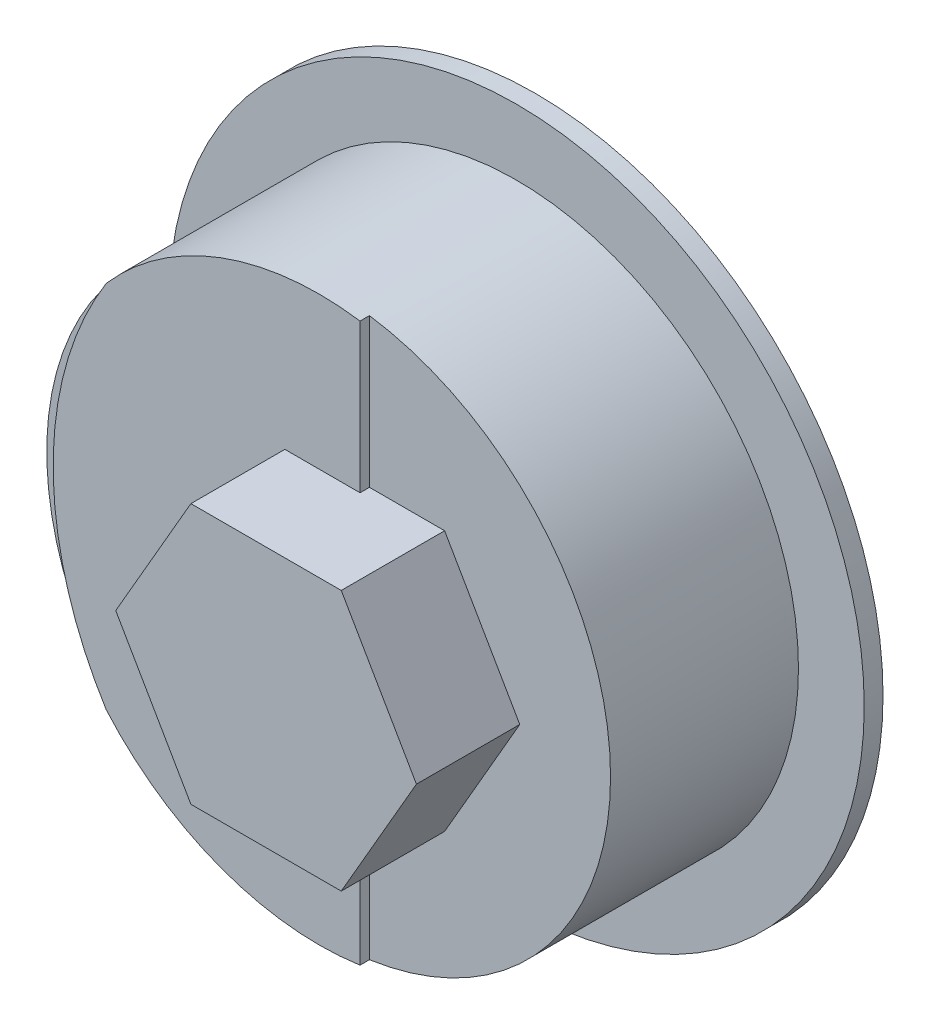
ISO-10303-21;
HEADER;
FILE_DESCRIPTION(('STEP AP214'),'2;1');
FILE_NAME('part.step','',(''),(''),'','','');
FILE_SCHEMA(('AUTOMOTIVE_DESIGN { 1 0 10303 214 1 1 1 1 }'));
ENDSEC;
DATA;
#1=APPLICATION_CONTEXT('core data for automotive mechanical design processes');
#2=APPLICATION_PROTOCOL_DEFINITION('international standard','automotive_design',2000,#1);
#3=PRODUCT_CONTEXT('',#1,'mechanical');
#4=PRODUCT('Part','Part','',(#3));
#5=PRODUCT_RELATED_PRODUCT_CATEGORY('part','',(#4));
#6=PRODUCT_DEFINITION_FORMATION('','',#4);
#7=PRODUCT_DEFINITION_CONTEXT('part definition',#1,'design');
#8=PRODUCT_DEFINITION('design','',#6,#7);
#9=PRODUCT_DEFINITION_SHAPE('','',#8);
#10=(LENGTH_UNIT() NAMED_UNIT(*) SI_UNIT(.MILLI.,.METRE.));
#11=(NAMED_UNIT(*) PLANE_ANGLE_UNIT() SI_UNIT($,.RADIAN.));
#12=(NAMED_UNIT(*) SI_UNIT($,.STERADIAN.) SOLID_ANGLE_UNIT());
#13=UNCERTAINTY_MEASURE_WITH_UNIT(LENGTH_MEASURE(1.E-05),#10,'distance_accuracy_value','');
#14=(GEOMETRIC_REPRESENTATION_CONTEXT(3) GLOBAL_UNCERTAINTY_ASSIGNED_CONTEXT((#13)) GLOBAL_UNIT_ASSIGNED_CONTEXT((#10,
#11,#12)) REPRESENTATION_CONTEXT('',''));
#15=CARTESIAN_POINT('',(0.,0.,0.));
#16=DIRECTION('',(0.,0.,1.));
#17=DIRECTION('',(1.,0.,0.));
#18=AXIS2_PLACEMENT_3D('',#15,#16,#17);
#19=CARTESIAN_POINT('',(0.,0.,5.));
#20=DIRECTION('',(0.,0.,1.));
#21=DIRECTION('',(1.,0.,0.));
#22=AXIS2_PLACEMENT_3D('',#19,#20,#21);
#23=PLANE('',#22);
#24=CARTESIAN_POINT('',(-2.17,0.,5.));
#25=DIRECTION('',(0.,0.,1.));
#26=DIRECTION('',(1.,0.,0.));
#27=AXIS2_PLACEMENT_3D('',#24,#25,#26);
#28=CIRCLE('',#27,15.);
#29=CARTESIAN_POINT('',(-13.5080645161291,9.82080918397741,5.));
#30=VERTEX_POINT('',#29);
#31=CARTESIAN_POINT('',(-13.5080645161291,-9.82080918397742,5.));
#32=VERTEX_POINT('',#31);
#33=EDGE_CURVE('E184',#30,#32,#28,.T.);
#34=ORIENTED_EDGE('',*,*,#33,.T.);
#35=CARTESIAN_POINT('',(2.17,0.,5.));
#36=DIRECTION('',(0.,0.,1.));
#37=DIRECTION('',(1.,0.,0.));
#38=AXIS2_PLACEMENT_3D('',#35,#36,#37);
#39=CIRCLE('',#38,18.5);
#40=EDGE_CURVE('E611',#30,#32,#39,.T.);
#41=ORIENTED_EDGE('',*,*,#40,.F.);
#42=EDGE_LOOP('',(#34,#41));
#43=FACE_BOUND('',#42,.T.);
#44=ADVANCED_FACE('F36',(#43),#23,.T.);
#45=DIRECTION('',(1.,0.,0.));
#46=VECTOR('',#45,1.);
#47=CARTESIAN_POINT('',(0.,-6.9282032302755,5.));
#48=LINE('',#47,#46);
#49=CARTESIAN_POINT('',(0.,-6.9282032302755,5.));
#50=VERTEX_POINT('',#49);
#51=CARTESIAN_POINT('',(4.,-6.9282032302755,5.));
#52=VERTEX_POINT('',#51);
#53=EDGE_CURVE('E198',#50,#52,#48,.T.);
#54=ORIENTED_EDGE('',*,*,#53,.F.);
#55=DIRECTION('',(0.,1.,0.));
#56=VECTOR('',#55,1.);
#57=CARTESIAN_POINT('',(0.,0.,5.));
#58=LINE('',#57,#56);
#59=CARTESIAN_POINT('',(0.,-14.8422067092464,5.));
#60=VERTEX_POINT('',#59);
#61=EDGE_CURVE('E603',#60,#50,#58,.T.);
#62=ORIENTED_EDGE('',*,*,#61,.F.);
#63=CARTESIAN_POINT('',(0.,14.8422067092464,5.));
#64=VERTEX_POINT('',#63);
#65=EDGE_CURVE('E277',#60,#64,#28,.T.);
#66=ORIENTED_EDGE('',*,*,#65,.T.);
#67=CARTESIAN_POINT('',(0.,6.9282032302755,5.));
#68=VERTEX_POINT('',#67);
#69=EDGE_CURVE('E178',#68,#64,#58,.T.);
#70=ORIENTED_EDGE('',*,*,#69,.F.);
#71=DIRECTION('',(-1.,0.,0.));
#72=VECTOR('',#71,1.);
#73=CARTESIAN_POINT('',(0.,6.9282032302755,5.));
#74=LINE('',#73,#72);
#75=CARTESIAN_POINT('',(3.99999999999999,6.9282032302755,5.));
#76=VERTEX_POINT('',#75);
#77=EDGE_CURVE('E210',#76,#68,#74,.T.);
#78=ORIENTED_EDGE('',*,*,#77,.F.);
#79=DIRECTION('',(-0.5,0.866025403784438,0.));
#80=VECTOR('',#79,1.);
#81=CARTESIAN_POINT('',(5.99999999999999,3.46410161513775,5.));
#82=LINE('',#81,#80);
#83=CARTESIAN_POINT('',(7.99999999999999,0.,5.));
#84=VERTEX_POINT('',#83);
#85=EDGE_CURVE('E188',#84,#76,#82,.T.);
#86=ORIENTED_EDGE('',*,*,#85,.F.);
#87=DIRECTION('',(0.5,0.866025403784439,0.));
#88=VECTOR('',#87,1.);
#89=CARTESIAN_POINT('',(5.99999999999999,-3.46410161513775,5.));
#90=LINE('',#89,#88);
#91=EDGE_CURVE('E185',#52,#84,#90,.T.);
#92=ORIENTED_EDGE('',*,*,#91,.F.);
#93=EDGE_LOOP('',(#54,#62,#66,#70,#78,#86,#92));
#94=FACE_BOUND('',#93,.T.);
#95=ADVANCED_FACE('F324',(#94),#23,.T.);
#96=CARTESIAN_POINT('',(0.,-6.9282032302755,10.5));
#97=DIRECTION('',(0.,1.,0.));
#98=DIRECTION('',(-1.,0.,0.));
#99=AXIS2_PLACEMENT_3D('',#96,#97,#98);
#100=PLANE('',#99);
#101=DIRECTION('',(0.,0.,-1.));
#102=VECTOR('',#101,1.);
#103=CARTESIAN_POINT('',(0.,-6.9282032302755,5.5));
#104=LINE('',#103,#102);
#105=CARTESIAN_POINT('',(0.,-6.9282032302755,5.5));
#106=VERTEX_POINT('',#105);
#107=EDGE_CURVE('E606',#106,#50,#104,.T.);
#108=ORIENTED_EDGE('',*,*,#107,.T.);
#109=ORIENTED_EDGE('',*,*,#53,.T.);
#110=DIRECTION('',(0.,0.,-1.));
#111=VECTOR('',#110,1.);
#112=CARTESIAN_POINT('',(4.,-6.9282032302755,10.5));
#113=LINE('',#112,#111);
#114=CARTESIAN_POINT('',(4.,-6.9282032302755,10.5));
#115=VERTEX_POINT('',#114);
#116=EDGE_CURVE('E207',#115,#52,#113,.T.);
#117=ORIENTED_EDGE('',*,*,#116,.F.);
#118=DIRECTION('',(1.,0.,0.));
#119=VECTOR('',#118,1.);
#120=CARTESIAN_POINT('',(0.,-6.9282032302755,10.5));
#121=LINE('',#120,#119);
#122=CARTESIAN_POINT('',(-3.99999999999999,-6.9282032302755,10.5));
#123=VERTEX_POINT('',#122);
#124=EDGE_CURVE('E206',#123,#115,#121,.T.);
#125=ORIENTED_EDGE('',*,*,#124,.F.);
#126=DIRECTION('',(0.,0.,-1.));
#127=VECTOR('',#126,1.);
#128=CARTESIAN_POINT('',(-3.99999999999999,-6.9282032302755,10.5));
#129=LINE('',#128,#127);
#130=CARTESIAN_POINT('',(-3.99999999999999,-6.9282032302755,5.5));
#131=VERTEX_POINT('',#130);
#132=EDGE_CURVE('E216',#123,#131,#129,.T.);
#133=ORIENTED_EDGE('',*,*,#132,.T.);
#134=DIRECTION('',(-1.,0.,0.));
#135=VECTOR('',#134,1.);
#136=CARTESIAN_POINT('',(0.,-6.9282032302755,5.5));
#137=LINE('',#136,#135);
#138=EDGE_CURVE('E614',#106,#131,#137,.T.);
#139=ORIENTED_EDGE('',*,*,#138,.F.);
#140=EDGE_LOOP('',(#108,#109,#117,#125,#133,#139));
#141=FACE_BOUND('',#140,.T.);
#142=ADVANCED_FACE('F330',(#141),#100,.F.);
#143=CARTESIAN_POINT('',(0.,6.9282032302755,10.5));
#144=DIRECTION('',(0.,-1.,0.));
#145=DIRECTION('',(0.,0.,-1.));
#146=AXIS2_PLACEMENT_3D('',#143,#144,#145);
#147=PLANE('',#146);
#148=DIRECTION('',(0.,0.,-1.));
#149=VECTOR('',#148,1.);
#150=CARTESIAN_POINT('',(0.,6.9282032302755,5.5));
#151=LINE('',#150,#149);
#152=CARTESIAN_POINT('',(0.,6.9282032302755,5.5));
#153=VERTEX_POINT('',#152);
#154=EDGE_CURVE('E615',#153,#68,#151,.T.);
#155=ORIENTED_EDGE('',*,*,#154,.F.);
#156=DIRECTION('',(1.,0.,0.));
#157=VECTOR('',#156,1.);
#158=CARTESIAN_POINT('',(0.,6.9282032302755,5.5));
#159=LINE('',#158,#157);
#160=CARTESIAN_POINT('',(-4.,6.9282032302755,5.5));
#161=VERTEX_POINT('',#160);
#162=EDGE_CURVE('E630',#161,#153,#159,.T.);
#163=ORIENTED_EDGE('',*,*,#162,.F.);
#164=DIRECTION('',(0.,0.,-1.));
#165=VECTOR('',#164,1.);
#166=CARTESIAN_POINT('',(-4.,6.9282032302755,10.5));
#167=LINE('',#166,#165);
#168=CARTESIAN_POINT('',(-4.,6.9282032302755,10.5));
#169=VERTEX_POINT('',#168);
#170=EDGE_CURVE('E222',#169,#161,#167,.T.);
#171=ORIENTED_EDGE('',*,*,#170,.F.);
#172=DIRECTION('',(-1.,0.,0.));
#173=VECTOR('',#172,1.);
#174=CARTESIAN_POINT('',(0.,6.9282032302755,10.5));
#175=LINE('',#174,#173);
#176=CARTESIAN_POINT('',(3.99999999999999,6.9282032302755,10.5));
#177=VERTEX_POINT('',#176);
#178=EDGE_CURVE('E200',#177,#169,#175,.T.);
#179=ORIENTED_EDGE('',*,*,#178,.F.);
#180=DIRECTION('',(0.,0.,-1.));
#181=VECTOR('',#180,1.);
#182=CARTESIAN_POINT('',(3.99999999999999,6.9282032302755,10.5));
#183=LINE('',#182,#181);
#184=EDGE_CURVE('E225',#177,#76,#183,.T.);
#185=ORIENTED_EDGE('',*,*,#184,.T.);
#186=ORIENTED_EDGE('',*,*,#77,.T.);
#187=EDGE_LOOP('',(#155,#163,#171,#179,#185,#186));
#188=FACE_BOUND('',#187,.T.);
#189=ADVANCED_FACE('F374',(#188),#147,.F.);
#190=CARTESIAN_POINT('',(0.,3.46410161513775,5.));
#191=DIRECTION('',(0.,-1.,0.));
#192=DIRECTION('',(1.,0.,0.));
#193=AXIS2_PLACEMENT_3D('',#190,#191,#192);
#194=PLANE('',#193);
#195=DIRECTION('',(0.,0.,-1.));
#196=VECTOR('',#195,1.);
#197=CARTESIAN_POINT('',(-2.,3.46410161513775,5.));
#198=LINE('',#197,#196);
#199=CARTESIAN_POINT('',(-2.,3.46410161513776,5.));
#200=VERTEX_POINT('',#199);
#201=CARTESIAN_POINT('',(-2.,3.46410161513776,-6.5));
#202=VERTEX_POINT('',#201);
#203=EDGE_CURVE('E282',#200,#202,#198,.T.);
#204=ORIENTED_EDGE('',*,*,#203,.T.);
#205=DIRECTION('',(-1.,0.,0.));
#206=VECTOR('',#205,1.);
#207=CARTESIAN_POINT('',(0.,3.46410161513775,-6.5));
#208=LINE('',#207,#206);
#209=CARTESIAN_POINT('',(2.,3.46410161513775,-6.5));
#210=VERTEX_POINT('',#209);
#211=EDGE_CURVE('E237',#210,#202,#208,.T.);
#212=ORIENTED_EDGE('',*,*,#211,.F.);
#213=DIRECTION('',(0.,0.,-1.));
#214=VECTOR('',#213,1.);
#215=CARTESIAN_POINT('',(2.,3.46410161513775,5.));
#216=LINE('',#215,#214);
#217=CARTESIAN_POINT('',(2.,3.46410161513775,5.));
#218=VERTEX_POINT('',#217);
#219=EDGE_CURVE('E11',#218,#210,#216,.T.);
#220=ORIENTED_EDGE('',*,*,#219,.F.);
#221=DIRECTION('',(-1.,0.,0.));
#222=VECTOR('',#221,1.);
#223=CARTESIAN_POINT('',(0.,3.46410161513775,5.));
#224=LINE('',#223,#222);
#225=EDGE_CURVE('E261',#218,#200,#224,.T.);
#226=ORIENTED_EDGE('',*,*,#225,.T.);
#227=EDGE_LOOP('',(#204,#212,#220,#226));
#228=FACE_BOUND('',#227,.T.);
#229=ADVANCED_FACE('F38',(#228),#194,.T.);
#230=CARTESIAN_POINT('',(3.,1.73205080756888,5.));
#231=DIRECTION('',(-0.866025403784439,-0.5,0.));
#232=DIRECTION('',(0.5,-0.866025403784439,0.));
#233=AXIS2_PLACEMENT_3D('',#230,#231,#232);
#234=PLANE('',#233);
#235=ORIENTED_EDGE('',*,*,#219,.T.);
#236=DIRECTION('',(-0.5,0.866025403784439,0.));
#237=VECTOR('',#236,1.);
#238=CARTESIAN_POINT('',(3.,1.73205080756888,-6.5));
#239=LINE('',#238,#237);
#240=CARTESIAN_POINT('',(4.,0.,-6.5));
#241=VERTEX_POINT('',#240);
#242=EDGE_CURVE('E234',#241,#210,#239,.T.);
#243=ORIENTED_EDGE('',*,*,#242,.F.);
#244=DIRECTION('',(0.,0.,-1.));
#245=VECTOR('',#244,1.);
#246=CARTESIAN_POINT('',(4.,0.,5.));
#247=LINE('',#246,#245);
#248=CARTESIAN_POINT('',(4.,0.,5.));
#249=VERTEX_POINT('',#248);
#250=EDGE_CURVE('E44',#249,#241,#247,.T.);
#251=ORIENTED_EDGE('',*,*,#250,.F.);
#252=DIRECTION('',(-0.5,0.866025403784439,0.));
#253=VECTOR('',#252,1.);
#254=CARTESIAN_POINT('',(3.,1.73205080756888,5.));
#255=LINE('',#254,#253);
#256=EDGE_CURVE('E264',#249,#218,#255,.T.);
#257=ORIENTED_EDGE('',*,*,#256,.T.);
#258=EDGE_LOOP('',(#235,#243,#251,#257));
#259=FACE_BOUND('',#258,.T.);
#260=ADVANCED_FACE('F296',(#259),#234,.T.);
#261=CARTESIAN_POINT('',(3.,-1.73205080756888,5.));
#262=DIRECTION('',(-0.866025403784439,0.5,0.));
#263=DIRECTION('',(-0.5,-0.866025403784439,0.));
#264=AXIS2_PLACEMENT_3D('',#261,#262,#263);
#265=PLANE('',#264);
#266=ORIENTED_EDGE('',*,*,#250,.T.);
#267=DIRECTION('',(0.5,0.866025403784439,0.));
#268=VECTOR('',#267,1.);
#269=CARTESIAN_POINT('',(3.,-1.73205080756888,-6.5));
#270=LINE('',#269,#268);
#271=CARTESIAN_POINT('',(2.,-3.46410161513776,-6.5));
#272=VERTEX_POINT('',#271);
#273=EDGE_CURVE('E231',#272,#241,#270,.T.);
#274=ORIENTED_EDGE('',*,*,#273,.F.);
#275=DIRECTION('',(0.,0.,-1.));
#276=VECTOR('',#275,1.);
#277=CARTESIAN_POINT('',(2.,-3.46410161513776,5.));
#278=LINE('',#277,#276);
#279=CARTESIAN_POINT('',(2.,-3.46410161513776,5.));
#280=VERTEX_POINT('',#279);
#281=EDGE_CURVE('E288',#280,#272,#278,.T.);
#282=ORIENTED_EDGE('',*,*,#281,.F.);
#283=DIRECTION('',(0.5,0.866025403784439,0.));
#284=VECTOR('',#283,1.);
#285=CARTESIAN_POINT('',(3.,-1.73205080756888,5.));
#286=LINE('',#285,#284);
#287=EDGE_CURVE('E267',#280,#249,#286,.T.);
#288=ORIENTED_EDGE('',*,*,#287,.T.);
#289=EDGE_LOOP('',(#266,#274,#282,#288));
#290=FACE_BOUND('',#289,.T.);
#291=ADVANCED_FACE('F293',(#290),#265,.T.);
#292=CARTESIAN_POINT('',(0.,-3.46410161513776,5.));
#293=DIRECTION('',(0.,1.,0.));
#294=DIRECTION('',(-1.,0.,0.));
#295=AXIS2_PLACEMENT_3D('',#292,#293,#294);
#296=PLANE('',#295);
#297=ORIENTED_EDGE('',*,*,#281,.T.);
#298=DIRECTION('',(1.,0.,0.));
#299=VECTOR('',#298,1.);
#300=CARTESIAN_POINT('',(0.,-3.46410161513776,-6.5));
#301=LINE('',#300,#299);
#302=CARTESIAN_POINT('',(-2.,-3.46410161513776,-6.5));
#303=VERTEX_POINT('',#302);
#304=EDGE_CURVE('E246',#303,#272,#301,.T.);
#305=ORIENTED_EDGE('',*,*,#304,.F.);
#306=DIRECTION('',(0.,0.,-1.));
#307=VECTOR('',#306,1.);
#308=CARTESIAN_POINT('',(-2.,-3.46410161513776,5.));
#309=LINE('',#308,#307);
#310=CARTESIAN_POINT('',(-2.,-3.46410161513776,5.));
#311=VERTEX_POINT('',#310);
#312=EDGE_CURVE('E286',#311,#303,#309,.T.);
#313=ORIENTED_EDGE('',*,*,#312,.F.);
#314=DIRECTION('',(1.,0.,0.));
#315=VECTOR('',#314,1.);
#316=CARTESIAN_POINT('',(0.,-3.46410161513776,5.));
#317=LINE('',#316,#315);
#318=EDGE_CURVE('E270',#311,#280,#317,.T.);
#319=ORIENTED_EDGE('',*,*,#318,.T.);
#320=EDGE_LOOP('',(#297,#305,#313,#319));
#321=FACE_BOUND('',#320,.T.);
#322=ADVANCED_FACE('F306',(#321),#296,.T.);
#323=CARTESIAN_POINT('',(-3.,-1.73205080756888,5.));
#324=DIRECTION('',(0.866025403784438,0.5,0.));
#325=DIRECTION('',(-0.5,0.866025403784438,0.));
#326=AXIS2_PLACEMENT_3D('',#323,#324,#325);
#327=PLANE('',#326);
#328=ORIENTED_EDGE('',*,*,#312,.T.);
#329=DIRECTION('',(0.5,-0.866025403784439,0.));
#330=VECTOR('',#329,1.);
#331=CARTESIAN_POINT('',(-3.,-1.73205080756888,-6.5));
#332=LINE('',#331,#330);
#333=CARTESIAN_POINT('',(-4.,0.,-6.5));
#334=VERTEX_POINT('',#333);
#335=EDGE_CURVE('E243',#334,#303,#332,.T.);
#336=ORIENTED_EDGE('',*,*,#335,.F.);
#337=DIRECTION('',(0.,0.,-1.));
#338=VECTOR('',#337,1.);
#339=CARTESIAN_POINT('',(-4.,0.,5.));
#340=LINE('',#339,#338);
#341=CARTESIAN_POINT('',(-4.,0.,5.));
#342=VERTEX_POINT('',#341);
#343=EDGE_CURVE('E284',#342,#334,#340,.T.);
#344=ORIENTED_EDGE('',*,*,#343,.F.);
#345=DIRECTION('',(0.5,-0.866025403784439,0.));
#346=VECTOR('',#345,1.);
#347=CARTESIAN_POINT('',(-3.,-1.73205080756888,5.));
#348=LINE('',#347,#346);
#349=EDGE_CURVE('E59',#342,#311,#348,.T.);
#350=ORIENTED_EDGE('',*,*,#349,.T.);
#351=EDGE_LOOP('',(#328,#336,#344,#350));
#352=FACE_BOUND('',#351,.T.);
#353=ADVANCED_FACE('F314',(#352),#327,.T.);
#354=CARTESIAN_POINT('',(-3.,1.73205080756887,5.));
#355=DIRECTION('',(0.866025403784439,-0.5,0.));
#356=DIRECTION('',(0.5,0.866025403784439,0.));
#357=AXIS2_PLACEMENT_3D('',#354,#355,#356);
#358=PLANE('',#357);
#359=ORIENTED_EDGE('',*,*,#343,.T.);
#360=DIRECTION('',(-0.5,-0.866025403784439,0.));
#361=VECTOR('',#360,1.);
#362=CARTESIAN_POINT('',(-3.,1.73205080756887,-6.5));
#363=LINE('',#362,#361);
#364=EDGE_CURVE('E240',#202,#334,#363,.T.);
#365=ORIENTED_EDGE('',*,*,#364,.F.);
#366=ORIENTED_EDGE('',*,*,#203,.F.);
#367=DIRECTION('',(-0.5,-0.866025403784439,0.));
#368=VECTOR('',#367,1.);
#369=CARTESIAN_POINT('',(-3.,1.73205080756887,5.));
#370=LINE('',#369,#368);
#371=EDGE_CURVE('E274',#200,#342,#370,.T.);
#372=ORIENTED_EDGE('',*,*,#371,.T.);
#373=EDGE_LOOP('',(#359,#365,#366,#372));
#374=FACE_BOUND('',#373,.T.);
#375=ADVANCED_FACE('F312',(#374),#358,.T.);
#376=CARTESIAN_POINT('',(-2.17,0.,5.));
#377=DIRECTION('',(0.,0.,-1.));
#378=DIRECTION('',(-1.,0.,0.));
#379=AXIS2_PLACEMENT_3D('',#376,#377,#378);
#380=CYLINDRICAL_SURFACE('',#379,15.);
#381=ORIENTED_EDGE('',*,*,#33,.F.);
#382=DIRECTION('',(0.,0.,-1.));
#383=VECTOR('',#382,1.);
#384=CARTESIAN_POINT('',(-13.5080645161291,9.82080918397741,5.5));
#385=LINE('',#384,#383);
#386=CARTESIAN_POINT('',(-13.5080645161291,9.82080918397741,5.5));
#387=VERTEX_POINT('',#386);
#388=EDGE_CURVE('E163',#387,#30,#385,.T.);
#389=ORIENTED_EDGE('',*,*,#388,.F.);
#390=CARTESIAN_POINT('',(-2.17,0.,5.5));
#391=DIRECTION('',(0.,0.,1.));
#392=DIRECTION('',(1.,0.,0.));
#393=AXIS2_PLACEMENT_3D('',#390,#391,#392);
#394=CIRCLE('',#393,15.);
#395=CARTESIAN_POINT('',(0.,14.8422067092464,5.5));
#396=VERTEX_POINT('',#395);
#397=EDGE_CURVE('E169',#396,#387,#394,.T.);
#398=ORIENTED_EDGE('',*,*,#397,.F.);
#399=DIRECTION('',(0.,0.,-1.));
#400=VECTOR('',#399,1.);
#401=CARTESIAN_POINT('',(0.,14.8422067092464,5.5));
#402=LINE('',#401,#400);
#403=EDGE_CURVE('E638',#396,#64,#402,.T.);
#404=ORIENTED_EDGE('',*,*,#403,.T.);
#405=ORIENTED_EDGE('',*,*,#65,.F.);
#406=DIRECTION('',(0.,0.,-1.));
#407=VECTOR('',#406,1.);
#408=CARTESIAN_POINT('',(0.,-14.8422067092464,5.5));
#409=LINE('',#408,#407);
#410=CARTESIAN_POINT('',(0.,-14.8422067092464,5.5));
#411=VERTEX_POINT('',#410);
#412=EDGE_CURVE('E190',#411,#60,#409,.T.);
#413=ORIENTED_EDGE('',*,*,#412,.F.);
#414=CARTESIAN_POINT('',(-13.5080645161291,-9.82080918397742,5.5));
#415=VERTEX_POINT('',#414);
#416=EDGE_CURVE('E168',#415,#411,#394,.T.);
#417=ORIENTED_EDGE('',*,*,#416,.F.);
#418=DIRECTION('',(0.,0.,-1.));
#419=VECTOR('',#418,1.);
#420=CARTESIAN_POINT('',(-13.5080645161291,-9.82080918397742,5.5));
#421=LINE('',#420,#419);
#422=EDGE_CURVE('E166',#415,#32,#421,.T.);
#423=ORIENTED_EDGE('',*,*,#422,.T.);
#424=EDGE_LOOP('',(#381,#389,#398,#404,#405,#413,#417,#423));
#425=FACE_BOUND('',#424,.T.);
#426=CARTESIAN_POINT('',(-2.17,0.,-5.));
#427=DIRECTION('',(0.,0.,1.));
#428=DIRECTION('',(1.,0.,0.));
#429=AXIS2_PLACEMENT_3D('',#426,#427,#428);
#430=CIRCLE('',#429,15.);
#431=CARTESIAN_POINT('',(12.83,0.,-5.));
#432=VERTEX_POINT('',#431);
#433=EDGE_CURVE('E258',#432,#432,#430,.T.);
#434=ORIENTED_EDGE('',*,*,#433,.T.);
#435=EDGE_LOOP('',(#434));
#436=FACE_BOUND('',#435,.T.);
#437=ADVANCED_FACE('F181',(#425,#436),#380,.T.);
#438=CARTESIAN_POINT('',(-2.17,0.,-6.));
#439=DIRECTION('',(0.,0.,1.));
#440=DIRECTION('',(1.,0.,0.));
#441=AXIS2_PLACEMENT_3D('',#438,#439,#440);
#442=CYLINDRICAL_SURFACE('',#441,18.5);
#443=CARTESIAN_POINT('',(-2.17,0.,-6.));
#444=DIRECTION('',(0.,0.,-1.));
#445=DIRECTION('',(-1.,0.,0.));
#446=AXIS2_PLACEMENT_3D('',#443,#444,#445);
#447=CIRCLE('',#446,18.5);
#448=CARTESIAN_POINT('',(-20.67,0.,-6.));
#449=VERTEX_POINT('',#448);
#450=EDGE_CURVE('E255',#449,#449,#447,.T.);
#451=ORIENTED_EDGE('',*,*,#450,.F.);
#452=EDGE_LOOP('',(#451));
#453=FACE_BOUND('',#452,.T.);
#454=CARTESIAN_POINT('',(-2.17,0.,-5.));
#455=DIRECTION('',(0.,0.,-1.));
#456=DIRECTION('',(-1.,0.,0.));
#457=AXIS2_PLACEMENT_3D('',#454,#455,#456);
#458=CIRCLE('',#457,18.5);
#459=CARTESIAN_POINT('',(-20.67,0.,-5.));
#460=VERTEX_POINT('',#459);
#461=EDGE_CURVE('E252',#460,#460,#458,.T.);
#462=ORIENTED_EDGE('',*,*,#461,.T.);
#463=EDGE_LOOP('',(#462));
#464=FACE_BOUND('',#463,.T.);
#465=ADVANCED_FACE('F334',(#453,#464),#442,.T.);
#466=CARTESIAN_POINT('',(0.,0.,-6.));
#467=DIRECTION('',(0.,0.,-1.));
#468=DIRECTION('',(-1.,0.,0.));
#469=AXIS2_PLACEMENT_3D('',#466,#467,#468);
#470=PLANE('',#469);
#471=CARTESIAN_POINT('',(0.,0.,-6.));
#472=DIRECTION('',(0.,0.,-1.));
#473=DIRECTION('',(-1.,0.,0.));
#474=AXIS2_PLACEMENT_3D('',#471,#472,#473);
#475=CIRCLE('',#474,7.5);
#476=CARTESIAN_POINT('',(-7.5,0.,-6.));
#477=VERTEX_POINT('',#476);
#478=EDGE_CURVE('E230',#477,#477,#475,.T.);
#479=ORIENTED_EDGE('',*,*,#478,.F.);
#480=EDGE_LOOP('',(#479));
#481=FACE_BOUND('',#480,.T.);
#482=ORIENTED_EDGE('',*,*,#450,.T.);
#483=EDGE_LOOP('',(#482));
#484=FACE_BOUND('',#483,.T.);
#485=ADVANCED_FACE('F340',(#481,#484),#470,.T.);
#486=CARTESIAN_POINT('',(0.,0.,-5.));
#487=DIRECTION('',(0.,0.,-1.));
#488=DIRECTION('',(-1.,0.,0.));
#489=AXIS2_PLACEMENT_3D('',#486,#487,#488);
#490=PLANE('',#489);
#491=ORIENTED_EDGE('',*,*,#433,.F.);
#492=EDGE_LOOP('',(#491));
#493=FACE_BOUND('',#492,.T.);
#494=ORIENTED_EDGE('',*,*,#461,.F.);
#495=EDGE_LOOP('',(#494));
#496=FACE_BOUND('',#495,.T.);
#497=ADVANCED_FACE('F345',(#493,#496),#490,.F.);
#498=CARTESIAN_POINT('',(0.,0.,-6.5));
#499=DIRECTION('',(0.,0.,1.));
#500=DIRECTION('',(1.,0.,0.));
#501=AXIS2_PLACEMENT_3D('',#498,#499,#500);
#502=CYLINDRICAL_SURFACE('',#501,7.5);
#503=CARTESIAN_POINT('',(0.,0.,-6.5));
#504=DIRECTION('',(0.,0.,-1.));
#505=DIRECTION('',(-1.,0.,0.));
#506=AXIS2_PLACEMENT_3D('',#503,#504,#505);
#507=CIRCLE('',#506,7.5);
#508=CARTESIAN_POINT('',(-7.5,0.,-6.5));
#509=VERTEX_POINT('',#508);
#510=EDGE_CURVE('E249',#509,#509,#507,.T.);
#511=ORIENTED_EDGE('',*,*,#510,.F.);
#512=EDGE_LOOP('',(#511));
#513=FACE_BOUND('',#512,.T.);
#514=ORIENTED_EDGE('',*,*,#478,.T.);
#515=EDGE_LOOP('',(#514));
#516=FACE_BOUND('',#515,.T.);
#517=ADVANCED_FACE('F353',(#513,#516),#502,.T.);
#518=CARTESIAN_POINT('',(0.,0.,-6.5));
#519=DIRECTION('',(0.,0.,-1.));
#520=DIRECTION('',(-1.,0.,0.));
#521=AXIS2_PLACEMENT_3D('',#518,#519,#520);
#522=PLANE('',#521);
#523=ORIENTED_EDGE('',*,*,#273,.T.);
#524=ORIENTED_EDGE('',*,*,#242,.T.);
#525=ORIENTED_EDGE('',*,*,#211,.T.);
#526=ORIENTED_EDGE('',*,*,#364,.T.);
#527=ORIENTED_EDGE('',*,*,#335,.T.);
#528=ORIENTED_EDGE('',*,*,#304,.T.);
#529=EDGE_LOOP('',(#523,#524,#525,#526,#527,#528));
#530=FACE_BOUND('',#529,.T.);
#531=ORIENTED_EDGE('',*,*,#510,.T.);
#532=EDGE_LOOP('',(#531));
#533=FACE_BOUND('',#532,.T.);
#534=ADVANCED_FACE('F300',(#530,#533),#522,.T.);
#535=CARTESIAN_POINT('',(0.,0.,10.5));
#536=DIRECTION('',(0.,0.,1.));
#537=DIRECTION('',(1.,0.,0.));
#538=AXIS2_PLACEMENT_3D('',#535,#536,#537);
#539=PLANE('',#538);
#540=DIRECTION('',(0.5,0.866025403784439,0.));
#541=VECTOR('',#540,1.);
#542=CARTESIAN_POINT('',(5.99999999999999,-3.46410161513775,10.5));
#543=LINE('',#542,#541);
#544=CARTESIAN_POINT('',(7.99999999999999,0.,10.5));
#545=VERTEX_POINT('',#544);
#546=EDGE_CURVE('E194',#115,#545,#543,.T.);
#547=ORIENTED_EDGE('',*,*,#546,.T.);
#548=DIRECTION('',(-0.5,0.866025403784438,0.));
#549=VECTOR('',#548,1.);
#550=CARTESIAN_POINT('',(5.99999999999999,3.46410161513775,10.5));
#551=LINE('',#550,#549);
#552=EDGE_CURVE('E197',#545,#177,#551,.T.);
#553=ORIENTED_EDGE('',*,*,#552,.T.);
#554=ORIENTED_EDGE('',*,*,#178,.T.);
#555=DIRECTION('',(-0.5,-0.866025403784439,0.));
#556=VECTOR('',#555,1.);
#557=CARTESIAN_POINT('',(-5.99999999999999,3.46410161513775,10.5));
#558=LINE('',#557,#556);
#559=CARTESIAN_POINT('',(-7.99999999999999,0.,10.5));
#560=VERTEX_POINT('',#559);
#561=EDGE_CURVE('E202',#169,#560,#558,.T.);
#562=ORIENTED_EDGE('',*,*,#561,.T.);
#563=DIRECTION('',(0.5,-0.866025403784438,0.));
#564=VECTOR('',#563,1.);
#565=CARTESIAN_POINT('',(-5.99999999999999,-3.46410161513775,10.5));
#566=LINE('',#565,#564);
#567=EDGE_CURVE('E204',#560,#123,#566,.T.);
#568=ORIENTED_EDGE('',*,*,#567,.T.);
#569=ORIENTED_EDGE('',*,*,#124,.T.);
#570=EDGE_LOOP('',(#547,#553,#554,#562,#568,#569));
#571=FACE_BOUND('',#570,.T.);
#572=ADVANCED_FACE('F364',(#571),#539,.T.);
#573=CARTESIAN_POINT('',(-5.99999999999999,-3.46410161513775,10.5));
#574=DIRECTION('',(0.866025403784438,0.5,0.));
#575=DIRECTION('',(-0.5,0.866025403784438,0.));
#576=AXIS2_PLACEMENT_3D('',#573,#574,#575);
#577=PLANE('',#576);
#578=DIRECTION('',(0.,0.,-1.));
#579=VECTOR('',#578,1.);
#580=CARTESIAN_POINT('',(-7.99999999999999,0.,10.5));
#581=LINE('',#580,#579);
#582=CARTESIAN_POINT('',(-7.99999999999999,0.,5.5));
#583=VERTEX_POINT('',#582);
#584=EDGE_CURVE('E219',#560,#583,#581,.T.);
#585=ORIENTED_EDGE('',*,*,#584,.T.);
#586=DIRECTION('',(-0.5,0.866025403784438,0.));
#587=VECTOR('',#586,1.);
#588=CARTESIAN_POINT('',(-5.99999999999999,-3.46410161513775,5.5));
#589=LINE('',#588,#587);
#590=EDGE_CURVE('E628',#131,#583,#589,.T.);
#591=ORIENTED_EDGE('',*,*,#590,.F.);
#592=ORIENTED_EDGE('',*,*,#132,.F.);
#593=ORIENTED_EDGE('',*,*,#567,.F.);
#594=EDGE_LOOP('',(#585,#591,#592,#593));
#595=FACE_BOUND('',#594,.T.);
#596=ADVANCED_FACE('F380',(#595),#577,.F.);
#597=CARTESIAN_POINT('',(-5.99999999999999,3.46410161513775,10.5));
#598=DIRECTION('',(0.866025403784439,-0.5,0.));
#599=DIRECTION('',(0.5,0.866025403784439,0.));
#600=AXIS2_PLACEMENT_3D('',#597,#598,#599);
#601=PLANE('',#600);
#602=ORIENTED_EDGE('',*,*,#170,.T.);
#603=DIRECTION('',(0.5,0.866025403784439,0.));
#604=VECTOR('',#603,1.);
#605=CARTESIAN_POINT('',(-5.99999999999999,3.46410161513775,5.5));
#606=LINE('',#605,#604);
#607=EDGE_CURVE('E51',#583,#161,#606,.T.);
#608=ORIENTED_EDGE('',*,*,#607,.F.);
#609=ORIENTED_EDGE('',*,*,#584,.F.);
#610=ORIENTED_EDGE('',*,*,#561,.F.);
#611=EDGE_LOOP('',(#602,#608,#609,#610));
#612=FACE_BOUND('',#611,.T.);
#613=ADVANCED_FACE('F372',(#612),#601,.F.);
#614=CARTESIAN_POINT('',(5.99999999999999,3.46410161513775,10.5));
#615=DIRECTION('',(-0.866025403784438,-0.500000000000001,0.));
#616=DIRECTION('',(0.500000000000001,-0.866025403784438,0.));
#617=AXIS2_PLACEMENT_3D('',#614,#615,#616);
#618=PLANE('',#617);
#619=ORIENTED_EDGE('',*,*,#85,.T.);
#620=ORIENTED_EDGE('',*,*,#184,.F.);
#621=ORIENTED_EDGE('',*,*,#552,.F.);
#622=DIRECTION('',(0.,0.,-1.));
#623=VECTOR('',#622,1.);
#624=CARTESIAN_POINT('',(7.99999999999999,0.,10.5));
#625=LINE('',#624,#623);
#626=EDGE_CURVE('E228',#545,#84,#625,.T.);
#627=ORIENTED_EDGE('',*,*,#626,.T.);
#628=EDGE_LOOP('',(#619,#620,#621,#627));
#629=FACE_BOUND('',#628,.T.);
#630=ADVANCED_FACE('F368',(#629),#618,.F.);
#631=CARTESIAN_POINT('',(5.99999999999999,-3.46410161513775,10.5));
#632=DIRECTION('',(-0.866025403784439,0.5,0.));
#633=DIRECTION('',(-0.5,-0.866025403784439,0.));
#634=AXIS2_PLACEMENT_3D('',#631,#632,#633);
#635=PLANE('',#634);
#636=ORIENTED_EDGE('',*,*,#91,.T.);
#637=ORIENTED_EDGE('',*,*,#626,.F.);
#638=ORIENTED_EDGE('',*,*,#546,.F.);
#639=ORIENTED_EDGE('',*,*,#116,.T.);
#640=EDGE_LOOP('',(#636,#637,#638,#639));
#641=FACE_BOUND('',#640,.T.);
#642=ADVANCED_FACE('F365',(#641),#635,.F.);
#643=CARTESIAN_POINT('',(0.,0.,5.));
#644=DIRECTION('',(0.,0.,1.));
#645=DIRECTION('',(1.,0.,0.));
#646=AXIS2_PLACEMENT_3D('',#643,#644,#645);
#647=PLANE('',#646);
#648=ORIENTED_EDGE('',*,*,#225,.F.);
#649=ORIENTED_EDGE('',*,*,#256,.F.);
#650=ORIENTED_EDGE('',*,*,#287,.F.);
#651=ORIENTED_EDGE('',*,*,#318,.F.);
#652=ORIENTED_EDGE('',*,*,#349,.F.);
#653=ORIENTED_EDGE('',*,*,#371,.F.);
#654=EDGE_LOOP('',(#648,#649,#650,#651,#652,#653));
#655=FACE_BOUND('',#654,.T.);
#656=ADVANCED_FACE('F307',(#655),#647,.F.);
#657=CARTESIAN_POINT('',(2.17,0.,5.5));
#658=DIRECTION('',(0.,0.,-1.));
#659=DIRECTION('',(-1.,0.,0.));
#660=AXIS2_PLACEMENT_3D('',#657,#658,#659);
#661=CYLINDRICAL_SURFACE('',#660,18.5);
#662=ORIENTED_EDGE('',*,*,#40,.T.);
#663=ORIENTED_EDGE('',*,*,#422,.F.);
#664=CARTESIAN_POINT('',(2.17,0.,5.5));
#665=DIRECTION('',(0.,0.,1.));
#666=DIRECTION('',(1.,0.,0.));
#667=AXIS2_PLACEMENT_3D('',#664,#665,#666);
#668=CIRCLE('',#667,18.5);
#669=EDGE_CURVE('E159',#387,#415,#668,.T.);
#670=ORIENTED_EDGE('',*,*,#669,.F.);
#671=ORIENTED_EDGE('',*,*,#388,.T.);
#672=EDGE_LOOP('',(#662,#663,#670,#671));
#673=FACE_BOUND('',#672,.T.);
#674=ADVANCED_FACE('F161',(#673),#661,.T.);
#675=CARTESIAN_POINT('',(0.,0.,5.5));
#676=DIRECTION('',(-1.,0.,0.));
#677=DIRECTION('',(0.,0.,1.));
#678=AXIS2_PLACEMENT_3D('',#675,#676,#677);
#679=PLANE('',#678);
#680=ORIENTED_EDGE('',*,*,#61,.T.);
#681=ORIENTED_EDGE('',*,*,#107,.F.);
#682=DIRECTION('',(0.,1.,0.));
#683=VECTOR('',#682,1.);
#684=CARTESIAN_POINT('',(0.,0.,5.5));
#685=LINE('',#684,#683);
#686=EDGE_CURVE('E632',#411,#106,#685,.T.);
#687=ORIENTED_EDGE('',*,*,#686,.F.);
#688=ORIENTED_EDGE('',*,*,#412,.T.);
#689=EDGE_LOOP('',(#680,#681,#687,#688));
#690=FACE_BOUND('',#689,.T.);
#691=ADVANCED_FACE('F395',(#690),#679,.F.);
#692=ORIENTED_EDGE('',*,*,#69,.T.);
#693=ORIENTED_EDGE('',*,*,#403,.F.);
#694=EDGE_CURVE('E174',#153,#396,#685,.T.);
#695=ORIENTED_EDGE('',*,*,#694,.F.);
#696=ORIENTED_EDGE('',*,*,#154,.T.);
#697=EDGE_LOOP('',(#692,#693,#695,#696));
#698=FACE_BOUND('',#697,.T.);
#699=ADVANCED_FACE('F396',(#698),#679,.F.);
#700=CARTESIAN_POINT('',(0.,0.,5.5));
#701=DIRECTION('',(0.,0.,1.));
#702=DIRECTION('',(1.,0.,0.));
#703=AXIS2_PLACEMENT_3D('',#700,#701,#702);
#704=PLANE('',#703);
#705=ORIENTED_EDGE('',*,*,#397,.T.);
#706=ORIENTED_EDGE('',*,*,#669,.T.);
#707=ORIENTED_EDGE('',*,*,#416,.T.);
#708=ORIENTED_EDGE('',*,*,#686,.T.);
#709=ORIENTED_EDGE('',*,*,#138,.T.);
#710=ORIENTED_EDGE('',*,*,#590,.T.);
#711=ORIENTED_EDGE('',*,*,#607,.T.);
#712=ORIENTED_EDGE('',*,*,#162,.T.);
#713=ORIENTED_EDGE('',*,*,#694,.T.);
#714=EDGE_LOOP('',(#705,#706,#707,#708,#709,#710,#711,#712,#713));
#715=FACE_BOUND('',#714,.T.);
#716=ADVANCED_FACE('F172',(#715),#704,.T.);
#717=CLOSED_SHELL('',(#44,#95,#142,#189,#229,#260,#291,#322,#353,#375,#437,#465,#485,#497,#517,
#534,#572,#596,#613,#630,#642,#656,#674,#691,#699,#716));
#718=MANIFOLD_SOLID_BREP('B2',#717);
#719=ADVANCED_BREP_SHAPE_REPRESENTATION('',(#18,#718),#14);
#720=SHAPE_DEFINITION_REPRESENTATION(#9,#719);
ENDSEC;
END-ISO-10303-21;
